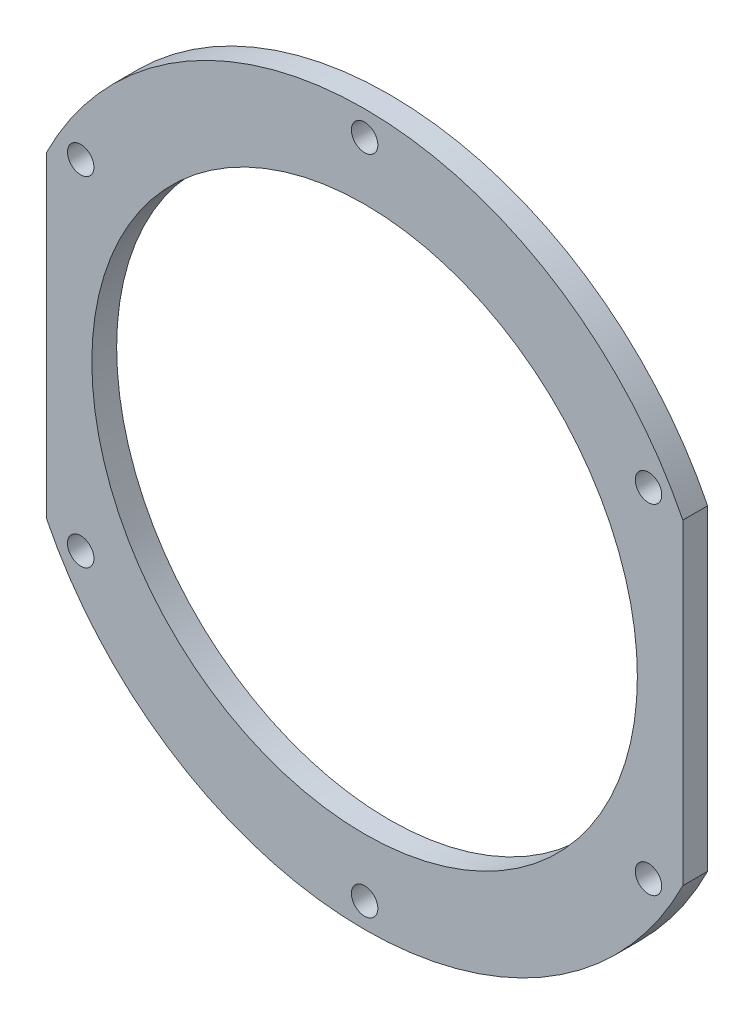
ISO-10303-21;
HEADER;
FILE_DESCRIPTION(('STEP AP214'),'2;1');
FILE_NAME('part.step','',(''),(''),'','','');
FILE_SCHEMA(('AUTOMOTIVE_DESIGN { 1 0 10303 214 1 1 1 1 }'));
ENDSEC;
DATA;
#1=APPLICATION_CONTEXT('core data for automotive mechanical design processes');
#2=APPLICATION_PROTOCOL_DEFINITION('international standard','automotive_design',2000,#1);
#3=PRODUCT_CONTEXT('',#1,'mechanical');
#4=PRODUCT('Part','Part','',(#3));
#5=PRODUCT_RELATED_PRODUCT_CATEGORY('part','',(#4));
#6=PRODUCT_DEFINITION_FORMATION('','',#4);
#7=PRODUCT_DEFINITION_CONTEXT('part definition',#1,'design');
#8=PRODUCT_DEFINITION('design','',#6,#7);
#9=PRODUCT_DEFINITION_SHAPE('','',#8);
#10=(LENGTH_UNIT() NAMED_UNIT(*) SI_UNIT(.MILLI.,.METRE.));
#11=(NAMED_UNIT(*) PLANE_ANGLE_UNIT() SI_UNIT($,.RADIAN.));
#12=(NAMED_UNIT(*) SI_UNIT($,.STERADIAN.) SOLID_ANGLE_UNIT());
#13=UNCERTAINTY_MEASURE_WITH_UNIT(LENGTH_MEASURE(1.E-05),#10,'distance_accuracy_value','');
#14=(GEOMETRIC_REPRESENTATION_CONTEXT(3) GLOBAL_UNCERTAINTY_ASSIGNED_CONTEXT((#13)) GLOBAL_UNIT_ASSIGNED_CONTEXT((#10,
#11,#12)) REPRESENTATION_CONTEXT('',''));
#15=CARTESIAN_POINT('',(0.,0.,0.));
#16=DIRECTION('',(0.,0.,1.));
#17=DIRECTION('',(1.,0.,0.));
#18=AXIS2_PLACEMENT_3D('',#15,#16,#17);
#19=CARTESIAN_POINT('',(0.,0.,3.));
#20=DIRECTION('',(0.,0.,1.));
#21=DIRECTION('',(1.,0.,0.));
#22=AXIS2_PLACEMENT_3D('',#19,#20,#21);
#23=PLANE('',#22);
#24=CARTESIAN_POINT('',(0.,40.,3.));
#25=DIRECTION('',(0.,0.,1.));
#26=DIRECTION('',(1.,0.,0.));
#27=AXIS2_PLACEMENT_3D('',#24,#25,#26);
#28=CIRCLE('',#27,1.59999999999999);
#29=CARTESIAN_POINT('',(1.59999999999999,40.,3.));
#30=VERTEX_POINT('',#29);
#31=EDGE_CURVE('E158',#30,#30,#28,.T.);
#32=ORIENTED_EDGE('',*,*,#31,.F.);
#33=EDGE_LOOP('',(#32));
#34=FACE_BOUND('',#33,.T.);
#35=CARTESIAN_POINT('',(0.,-40.,3.));
#36=DIRECTION('',(0.,0.,1.));
#37=DIRECTION('',(1.,0.,0.));
#38=AXIS2_PLACEMENT_3D('',#35,#36,#37);
#39=CIRCLE('',#38,1.59999999999999);
#40=CARTESIAN_POINT('',(1.59999999999999,-40.,3.));
#41=VERTEX_POINT('',#40);
#42=EDGE_CURVE('E155',#41,#41,#39,.T.);
#43=ORIENTED_EDGE('',*,*,#42,.F.);
#44=EDGE_LOOP('',(#43));
#45=FACE_BOUND('',#44,.T.);
#46=CARTESIAN_POINT('',(34.3474889911912,-20.5,3.));
#47=DIRECTION('',(0.,0.,1.));
#48=DIRECTION('',(1.,0.,0.));
#49=AXIS2_PLACEMENT_3D('',#46,#47,#48);
#50=CIRCLE('',#49,1.59999999999998);
#51=CARTESIAN_POINT('',(35.9474889911912,-20.5,3.));
#52=VERTEX_POINT('',#51);
#53=EDGE_CURVE('E148',#52,#52,#50,.T.);
#54=ORIENTED_EDGE('',*,*,#53,.F.);
#55=EDGE_LOOP('',(#54));
#56=FACE_BOUND('',#55,.T.);
#57=CARTESIAN_POINT('',(34.3474889911912,20.5,3.));
#58=DIRECTION('',(0.,0.,1.));
#59=DIRECTION('',(1.,0.,0.));
#60=AXIS2_PLACEMENT_3D('',#57,#58,#59);
#61=CIRCLE('',#60,1.59999999999998);
#62=CARTESIAN_POINT('',(35.9474889911912,20.5,3.));
#63=VERTEX_POINT('',#62);
#64=EDGE_CURVE('E139',#63,#63,#61,.T.);
#65=ORIENTED_EDGE('',*,*,#64,.F.);
#66=EDGE_LOOP('',(#65));
#67=FACE_BOUND('',#66,.T.);
#68=CARTESIAN_POINT('',(-34.3474889911912,-20.5,3.));
#69=DIRECTION('',(0.,0.,1.));
#70=DIRECTION('',(1.,0.,0.));
#71=AXIS2_PLACEMENT_3D('',#68,#69,#70);
#72=CIRCLE('',#71,1.59999999999998);
#73=CARTESIAN_POINT('',(-32.7474889911912,-20.5,3.));
#74=VERTEX_POINT('',#73);
#75=EDGE_CURVE('E133',#74,#74,#72,.T.);
#76=ORIENTED_EDGE('',*,*,#75,.F.);
#77=EDGE_LOOP('',(#76));
#78=FACE_BOUND('',#77,.T.);
#79=CARTESIAN_POINT('',(-34.3474889911912,20.5,3.));
#80=DIRECTION('',(0.,0.,1.));
#81=DIRECTION('',(1.,0.,0.));
#82=AXIS2_PLACEMENT_3D('',#79,#80,#81);
#83=CIRCLE('',#82,1.59999999999998);
#84=CARTESIAN_POINT('',(-32.7474889911912,20.5,3.));
#85=VERTEX_POINT('',#84);
#86=EDGE_CURVE('E126',#85,#85,#83,.T.);
#87=ORIENTED_EDGE('',*,*,#86,.F.);
#88=EDGE_LOOP('',(#87));
#89=FACE_BOUND('',#88,.T.);
#90=CARTESIAN_POINT('',(0.,0.,3.));
#91=DIRECTION('',(0.,0.,1.));
#92=DIRECTION('',(1.,0.,0.));
#93=AXIS2_PLACEMENT_3D('',#90,#91,#92);
#94=CIRCLE('',#93,43.);
#95=CARTESIAN_POINT('',(38.5,19.1507180022055,3.));
#96=VERTEX_POINT('',#95);
#97=CARTESIAN_POINT('',(-38.5,19.1507180022055,3.));
#98=VERTEX_POINT('',#97);
#99=EDGE_CURVE('E91',#96,#98,#94,.T.);
#100=ORIENTED_EDGE('',*,*,#99,.T.);
#101=DIRECTION('',(0.,-1.,0.));
#102=VECTOR('',#101,1.);
#103=CARTESIAN_POINT('',(-38.5,-19.1507180022055,3.));
#104=LINE('',#103,#102);
#105=CARTESIAN_POINT('',(-38.5,-19.1507180022055,3.));
#106=VERTEX_POINT('',#105);
#107=EDGE_CURVE('E86',#98,#106,#104,.T.);
#108=ORIENTED_EDGE('',*,*,#107,.T.);
#109=CARTESIAN_POINT('',(0.,0.,3.));
#110=DIRECTION('',(0.,0.,1.));
#111=DIRECTION('',(1.,0.,0.));
#112=AXIS2_PLACEMENT_3D('',#109,#110,#111);
#113=CIRCLE('',#112,43.);
#114=CARTESIAN_POINT('',(38.5,-19.1507180022055,3.));
#115=VERTEX_POINT('',#114);
#116=EDGE_CURVE('E93',#106,#115,#113,.T.);
#117=ORIENTED_EDGE('',*,*,#116,.T.);
#118=DIRECTION('',(0.,1.,0.));
#119=VECTOR('',#118,1.);
#120=CARTESIAN_POINT('',(38.5,-19.1507180022055,3.));
#121=LINE('',#120,#119);
#122=EDGE_CURVE('E59',#115,#96,#121,.T.);
#123=ORIENTED_EDGE('',*,*,#122,.T.);
#124=EDGE_LOOP('',(#100,#108,#117,#123));
#125=FACE_BOUND('',#124,.T.);
#126=CARTESIAN_POINT('',(0.,0.,3.));
#127=DIRECTION('',(0.,0.,1.));
#128=DIRECTION('',(1.,0.,0.));
#129=AXIS2_PLACEMENT_3D('',#126,#127,#128);
#130=CIRCLE('',#129,33.);
#131=CARTESIAN_POINT('',(33.,0.,3.));
#132=VERTEX_POINT('',#131);
#133=EDGE_CURVE('E107',#132,#132,#130,.T.);
#134=ORIENTED_EDGE('',*,*,#133,.F.);
#135=EDGE_LOOP('',(#134));
#136=FACE_BOUND('',#135,.T.);
#137=ADVANCED_FACE('F41',(#34,#45,#56,#67,#78,#89,#125,#136),#23,.T.);
#138=CARTESIAN_POINT('',(0.,0.,0.));
#139=DIRECTION('',(0.,0.,1.));
#140=DIRECTION('',(1.,0.,0.));
#141=AXIS2_PLACEMENT_3D('',#138,#139,#140);
#142=PLANE('',#141);
#143=CARTESIAN_POINT('',(0.,40.,0.));
#144=DIRECTION('',(0.,0.,1.));
#145=DIRECTION('',(1.,0.,0.));
#146=AXIS2_PLACEMENT_3D('',#143,#144,#145);
#147=CIRCLE('',#146,1.6);
#148=CARTESIAN_POINT('',(1.6,40.,0.));
#149=VERTEX_POINT('',#148);
#150=EDGE_CURVE('E154',#149,#149,#147,.T.);
#151=ORIENTED_EDGE('',*,*,#150,.T.);
#152=EDGE_LOOP('',(#151));
#153=FACE_BOUND('',#152,.T.);
#154=CARTESIAN_POINT('',(0.,-40.,0.));
#155=DIRECTION('',(0.,0.,1.));
#156=DIRECTION('',(1.,0.,0.));
#157=AXIS2_PLACEMENT_3D('',#154,#155,#156);
#158=CIRCLE('',#157,1.6);
#159=CARTESIAN_POINT('',(1.6,-40.,0.));
#160=VERTEX_POINT('',#159);
#161=EDGE_CURVE('E149',#160,#160,#158,.T.);
#162=ORIENTED_EDGE('',*,*,#161,.T.);
#163=EDGE_LOOP('',(#162));
#164=FACE_BOUND('',#163,.T.);
#165=CARTESIAN_POINT('',(34.3474889911912,-20.5,0.));
#166=DIRECTION('',(0.,0.,1.));
#167=DIRECTION('',(1.,0.,0.));
#168=AXIS2_PLACEMENT_3D('',#165,#166,#167);
#169=CIRCLE('',#168,1.6);
#170=CARTESIAN_POINT('',(35.9474889911912,-20.5,0.));
#171=VERTEX_POINT('',#170);
#172=EDGE_CURVE('E141',#171,#171,#169,.T.);
#173=ORIENTED_EDGE('',*,*,#172,.T.);
#174=EDGE_LOOP('',(#173));
#175=FACE_BOUND('',#174,.T.);
#176=CARTESIAN_POINT('',(34.3474889911912,20.5,0.));
#177=DIRECTION('',(0.,0.,1.));
#178=DIRECTION('',(1.,0.,0.));
#179=AXIS2_PLACEMENT_3D('',#176,#177,#178);
#180=CIRCLE('',#179,1.6);
#181=CARTESIAN_POINT('',(35.9474889911912,20.5,0.));
#182=VERTEX_POINT('',#181);
#183=EDGE_CURVE('E140',#182,#182,#180,.T.);
#184=ORIENTED_EDGE('',*,*,#183,.T.);
#185=EDGE_LOOP('',(#184));
#186=FACE_BOUND('',#185,.T.);
#187=CARTESIAN_POINT('',(-34.3474889911912,-20.5,0.));
#188=DIRECTION('',(0.,0.,1.));
#189=DIRECTION('',(1.,0.,0.));
#190=AXIS2_PLACEMENT_3D('',#187,#188,#189);
#191=CIRCLE('',#190,1.6);
#192=CARTESIAN_POINT('',(-32.7474889911912,-20.5,0.));
#193=VERTEX_POINT('',#192);
#194=EDGE_CURVE('E131',#193,#193,#191,.T.);
#195=ORIENTED_EDGE('',*,*,#194,.T.);
#196=EDGE_LOOP('',(#195));
#197=FACE_BOUND('',#196,.T.);
#198=CARTESIAN_POINT('',(-34.3474889911912,20.5,0.));
#199=DIRECTION('',(0.,0.,1.));
#200=DIRECTION('',(1.,0.,0.));
#201=AXIS2_PLACEMENT_3D('',#198,#199,#200);
#202=CIRCLE('',#201,1.6);
#203=CARTESIAN_POINT('',(-32.7474889911912,20.5,0.));
#204=VERTEX_POINT('',#203);
#205=EDGE_CURVE('E123',#204,#204,#202,.T.);
#206=ORIENTED_EDGE('',*,*,#205,.T.);
#207=EDGE_LOOP('',(#206));
#208=FACE_BOUND('',#207,.T.);
#209=CARTESIAN_POINT('',(0.,0.,0.));
#210=DIRECTION('',(0.,0.,1.));
#211=DIRECTION('',(1.,0.,0.));
#212=AXIS2_PLACEMENT_3D('',#209,#210,#211);
#213=CIRCLE('',#212,43.);
#214=CARTESIAN_POINT('',(38.5,19.1507180022055,0.));
#215=VERTEX_POINT('',#214);
#216=CARTESIAN_POINT('',(-38.5,19.1507180022055,0.));
#217=VERTEX_POINT('',#216);
#218=EDGE_CURVE('E104',#215,#217,#213,.T.);
#219=ORIENTED_EDGE('',*,*,#218,.F.);
#220=DIRECTION('',(0.,1.,0.));
#221=VECTOR('',#220,1.);
#222=CARTESIAN_POINT('',(38.5,-19.1507180022055,0.));
#223=LINE('',#222,#221);
#224=CARTESIAN_POINT('',(38.5,-19.1507180022055,0.));
#225=VERTEX_POINT('',#224);
#226=EDGE_CURVE('E81',#225,#215,#223,.T.);
#227=ORIENTED_EDGE('',*,*,#226,.F.);
#228=CARTESIAN_POINT('',(0.,0.,0.));
#229=DIRECTION('',(0.,0.,1.));
#230=DIRECTION('',(1.,0.,0.));
#231=AXIS2_PLACEMENT_3D('',#228,#229,#230);
#232=CIRCLE('',#231,43.);
#233=CARTESIAN_POINT('',(-38.5,-19.1507180022055,0.));
#234=VERTEX_POINT('',#233);
#235=EDGE_CURVE('E73',#234,#225,#232,.T.);
#236=ORIENTED_EDGE('',*,*,#235,.F.);
#237=DIRECTION('',(0.,-1.,0.));
#238=VECTOR('',#237,1.);
#239=CARTESIAN_POINT('',(-38.5,-19.1507180022055,0.));
#240=LINE('',#239,#238);
#241=EDGE_CURVE('E100',#217,#234,#240,.T.);
#242=ORIENTED_EDGE('',*,*,#241,.F.);
#243=EDGE_LOOP('',(#219,#227,#236,#242));
#244=FACE_BOUND('',#243,.T.);
#245=CARTESIAN_POINT('',(0.,0.,0.));
#246=DIRECTION('',(0.,0.,1.));
#247=DIRECTION('',(1.,0.,0.));
#248=AXIS2_PLACEMENT_3D('',#245,#246,#247);
#249=CIRCLE('',#248,33.);
#250=CARTESIAN_POINT('',(33.,0.,0.));
#251=VERTEX_POINT('',#250);
#252=EDGE_CURVE('E120',#251,#251,#249,.T.);
#253=ORIENTED_EDGE('',*,*,#252,.T.);
#254=EDGE_LOOP('',(#253));
#255=FACE_BOUND('',#254,.T.);
#256=ADVANCED_FACE('F116',(#153,#164,#175,#186,#197,#208,#244,#255),#142,.F.);
#257=CARTESIAN_POINT('',(0.,0.,3.));
#258=DIRECTION('',(0.,0.,-1.));
#259=DIRECTION('',(-1.,0.,0.));
#260=AXIS2_PLACEMENT_3D('',#257,#258,#259);
#261=CYLINDRICAL_SURFACE('',#260,43.);
#262=ORIENTED_EDGE('',*,*,#218,.T.);
#263=DIRECTION('',(0.,0.,-1.));
#264=VECTOR('',#263,1.);
#265=CARTESIAN_POINT('',(-38.5,19.1507180022055,3.));
#266=LINE('',#265,#264);
#267=EDGE_CURVE('E11',#98,#217,#266,.T.);
#268=ORIENTED_EDGE('',*,*,#267,.F.);
#269=ORIENTED_EDGE('',*,*,#99,.F.);
#270=DIRECTION('',(0.,0.,-1.));
#271=VECTOR('',#270,1.);
#272=CARTESIAN_POINT('',(38.5,19.1507180022055,3.));
#273=LINE('',#272,#271);
#274=EDGE_CURVE('E101',#96,#215,#273,.T.);
#275=ORIENTED_EDGE('',*,*,#274,.T.);
#276=EDGE_LOOP('',(#262,#268,#269,#275));
#277=FACE_BOUND('',#276,.T.);
#278=ADVANCED_FACE('F43',(#277),#261,.T.);
#279=CARTESIAN_POINT('',(-38.5,-19.1507180022055,3.));
#280=DIRECTION('',(1.,0.,0.));
#281=DIRECTION('',(0.,0.,-1.));
#282=AXIS2_PLACEMENT_3D('',#279,#280,#281);
#283=PLANE('',#282);
#284=ORIENTED_EDGE('',*,*,#241,.T.);
#285=DIRECTION('',(0.,0.,-1.));
#286=VECTOR('',#285,1.);
#287=CARTESIAN_POINT('',(-38.5,-19.1507180022055,3.));
#288=LINE('',#287,#286);
#289=EDGE_CURVE('E49',#106,#234,#288,.T.);
#290=ORIENTED_EDGE('',*,*,#289,.F.);
#291=ORIENTED_EDGE('',*,*,#107,.F.);
#292=ORIENTED_EDGE('',*,*,#267,.T.);
#293=EDGE_LOOP('',(#284,#290,#291,#292));
#294=FACE_BOUND('',#293,.T.);
#295=ADVANCED_FACE('F96',(#294),#283,.F.);
#296=CARTESIAN_POINT('',(0.,0.,3.));
#297=DIRECTION('',(0.,0.,-1.));
#298=DIRECTION('',(-1.,0.,0.));
#299=AXIS2_PLACEMENT_3D('',#296,#297,#298);
#300=CYLINDRICAL_SURFACE('',#299,43.);
#301=ORIENTED_EDGE('',*,*,#235,.T.);
#302=DIRECTION('',(0.,0.,-1.));
#303=VECTOR('',#302,1.);
#304=CARTESIAN_POINT('',(38.5,-19.1507180022055,3.));
#305=LINE('',#304,#303);
#306=EDGE_CURVE('E98',#115,#225,#305,.T.);
#307=ORIENTED_EDGE('',*,*,#306,.F.);
#308=ORIENTED_EDGE('',*,*,#116,.F.);
#309=ORIENTED_EDGE('',*,*,#289,.T.);
#310=EDGE_LOOP('',(#301,#307,#308,#309));
#311=FACE_BOUND('',#310,.T.);
#312=ADVANCED_FACE('F97',(#311),#300,.T.);
#313=CARTESIAN_POINT('',(38.5,-19.1507180022055,3.));
#314=DIRECTION('',(-1.,0.,0.));
#315=DIRECTION('',(0.,0.,1.));
#316=AXIS2_PLACEMENT_3D('',#313,#314,#315);
#317=PLANE('',#316);
#318=ORIENTED_EDGE('',*,*,#226,.T.);
#319=ORIENTED_EDGE('',*,*,#274,.F.);
#320=ORIENTED_EDGE('',*,*,#122,.F.);
#321=ORIENTED_EDGE('',*,*,#306,.T.);
#322=EDGE_LOOP('',(#318,#319,#320,#321));
#323=FACE_BOUND('',#322,.T.);
#324=ADVANCED_FACE('F114',(#323),#317,.F.);
#325=CARTESIAN_POINT('',(0.,0.,3.));
#326=DIRECTION('',(0.,0.,-1.));
#327=DIRECTION('',(-1.,0.,0.));
#328=AXIS2_PLACEMENT_3D('',#325,#326,#327);
#329=CYLINDRICAL_SURFACE('',#328,33.);
#330=ORIENTED_EDGE('',*,*,#133,.T.);
#331=EDGE_LOOP('',(#330));
#332=FACE_BOUND('',#331,.T.);
#333=ORIENTED_EDGE('',*,*,#252,.F.);
#334=EDGE_LOOP('',(#333));
#335=FACE_BOUND('',#334,.T.);
#336=ADVANCED_FACE('F179',(#332,#335),#329,.F.);
#337=CARTESIAN_POINT('',(-34.3474889911912,20.5,3.));
#338=DIRECTION('',(0.,0.,1.));
#339=DIRECTION('',(1.,0.,0.));
#340=AXIS2_PLACEMENT_3D('',#337,#338,#339);
#341=CYLINDRICAL_SURFACE('',#340,1.59999999999999);
#342=ORIENTED_EDGE('',*,*,#205,.F.);
#343=EDGE_LOOP('',(#342));
#344=FACE_BOUND('',#343,.T.);
#345=ORIENTED_EDGE('',*,*,#86,.T.);
#346=EDGE_LOOP('',(#345));
#347=FACE_BOUND('',#346,.T.);
#348=ADVANCED_FACE('F180',(#344,#347),#341,.F.);
#349=CARTESIAN_POINT('',(-34.3474889911912,-20.5,3.));
#350=DIRECTION('',(0.,0.,1.));
#351=DIRECTION('',(1.,0.,0.));
#352=AXIS2_PLACEMENT_3D('',#349,#350,#351);
#353=CYLINDRICAL_SURFACE('',#352,1.59999999999999);
#354=ORIENTED_EDGE('',*,*,#194,.F.);
#355=EDGE_LOOP('',(#354));
#356=FACE_BOUND('',#355,.T.);
#357=ORIENTED_EDGE('',*,*,#75,.T.);
#358=EDGE_LOOP('',(#357));
#359=FACE_BOUND('',#358,.T.);
#360=ADVANCED_FACE('F177',(#356,#359),#353,.F.);
#361=CARTESIAN_POINT('',(34.3474889911912,20.5,3.));
#362=DIRECTION('',(0.,0.,1.));
#363=DIRECTION('',(1.,0.,0.));
#364=AXIS2_PLACEMENT_3D('',#361,#362,#363);
#365=CYLINDRICAL_SURFACE('',#364,1.59999999999999);
#366=ORIENTED_EDGE('',*,*,#183,.F.);
#367=EDGE_LOOP('',(#366));
#368=FACE_BOUND('',#367,.T.);
#369=ORIENTED_EDGE('',*,*,#64,.T.);
#370=EDGE_LOOP('',(#369));
#371=FACE_BOUND('',#370,.T.);
#372=ADVANCED_FACE('F187',(#368,#371),#365,.F.);
#373=CARTESIAN_POINT('',(34.3474889911912,-20.5,3.));
#374=DIRECTION('',(0.,0.,1.));
#375=DIRECTION('',(1.,0.,0.));
#376=AXIS2_PLACEMENT_3D('',#373,#374,#375);
#377=CYLINDRICAL_SURFACE('',#376,1.59999999999999);
#378=ORIENTED_EDGE('',*,*,#172,.F.);
#379=EDGE_LOOP('',(#378));
#380=FACE_BOUND('',#379,.T.);
#381=ORIENTED_EDGE('',*,*,#53,.T.);
#382=EDGE_LOOP('',(#381));
#383=FACE_BOUND('',#382,.T.);
#384=ADVANCED_FACE('F255',(#380,#383),#377,.F.);
#385=CARTESIAN_POINT('',(0.,-40.,3.));
#386=DIRECTION('',(0.,0.,1.));
#387=DIRECTION('',(1.,0.,0.));
#388=AXIS2_PLACEMENT_3D('',#385,#386,#387);
#389=CYLINDRICAL_SURFACE('',#388,1.59999999999999);
#390=ORIENTED_EDGE('',*,*,#161,.F.);
#391=EDGE_LOOP('',(#390));
#392=FACE_BOUND('',#391,.T.);
#393=ORIENTED_EDGE('',*,*,#42,.T.);
#394=EDGE_LOOP('',(#393));
#395=FACE_BOUND('',#394,.T.);
#396=ADVANCED_FACE('F263',(#392,#395),#389,.F.);
#397=CARTESIAN_POINT('',(0.,40.,3.));
#398=DIRECTION('',(0.,0.,1.));
#399=DIRECTION('',(1.,0.,0.));
#400=AXIS2_PLACEMENT_3D('',#397,#398,#399);
#401=CYLINDRICAL_SURFACE('',#400,1.59999999999999);
#402=ORIENTED_EDGE('',*,*,#150,.F.);
#403=EDGE_LOOP('',(#402));
#404=FACE_BOUND('',#403,.T.);
#405=ORIENTED_EDGE('',*,*,#31,.T.);
#406=EDGE_LOOP('',(#405));
#407=FACE_BOUND('',#406,.T.);
#408=ADVANCED_FACE('F165',(#404,#407),#401,.F.);
#409=CLOSED_SHELL('',(#137,#256,#278,#295,#312,#324,#336,#348,#360,#372,#384,#396,#408));
#410=MANIFOLD_SOLID_BREP('B2',#409);
#411=ADVANCED_BREP_SHAPE_REPRESENTATION('',(#18,#410),#14);
#412=SHAPE_DEFINITION_REPRESENTATION(#9,#411);
ENDSEC;
END-ISO-10303-21;
